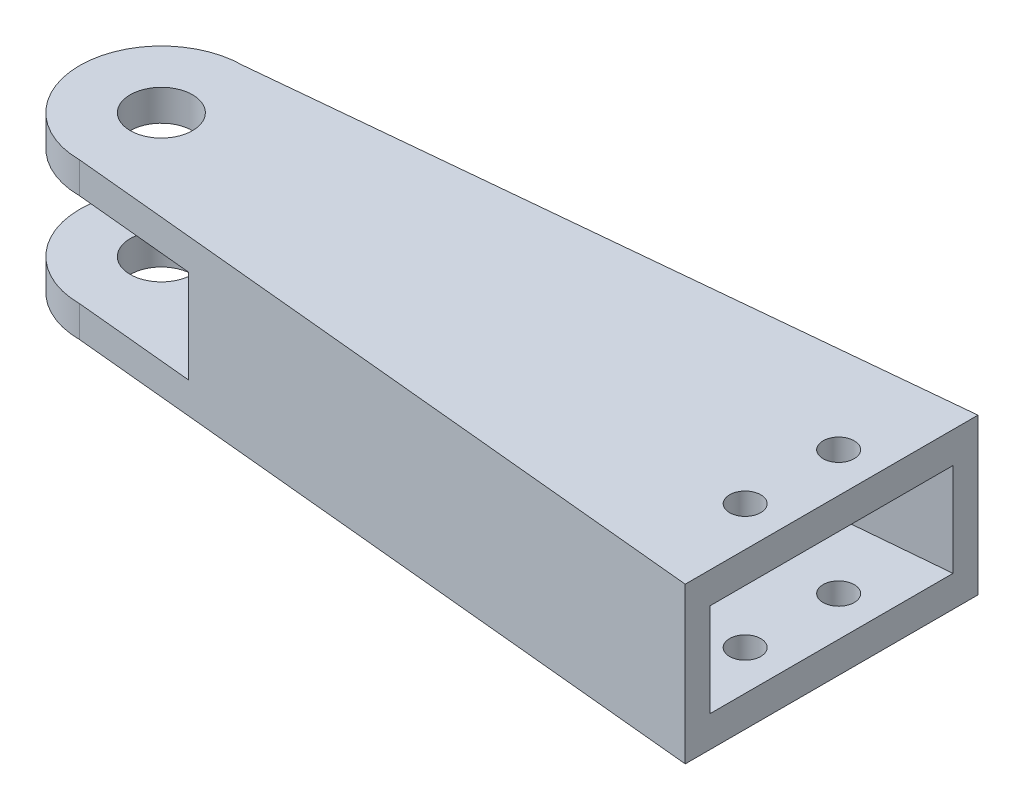
ISO-10303-21;
HEADER;
FILE_DESCRIPTION(('STEP AP214'),'2;1');
FILE_NAME('part.step','',(''),(''),'','','');
FILE_SCHEMA(('AUTOMOTIVE_DESIGN { 1 0 10303 214 1 1 1 1 }'));
ENDSEC;
DATA;
#1=APPLICATION_CONTEXT('core data for automotive mechanical design processes');
#2=APPLICATION_PROTOCOL_DEFINITION('international standard','automotive_design',2000,#1);
#3=PRODUCT_CONTEXT('',#1,'mechanical');
#4=PRODUCT('Part','Part','',(#3));
#5=PRODUCT_RELATED_PRODUCT_CATEGORY('part','',(#4));
#6=PRODUCT_DEFINITION_FORMATION('','',#4);
#7=PRODUCT_DEFINITION_CONTEXT('part definition',#1,'design');
#8=PRODUCT_DEFINITION('design','',#6,#7);
#9=PRODUCT_DEFINITION_SHAPE('','',#8);
#10=(LENGTH_UNIT() NAMED_UNIT(*) SI_UNIT(.MILLI.,.METRE.));
#11=(NAMED_UNIT(*) PLANE_ANGLE_UNIT() SI_UNIT($,.RADIAN.));
#12=(NAMED_UNIT(*) SI_UNIT($,.STERADIAN.) SOLID_ANGLE_UNIT());
#13=UNCERTAINTY_MEASURE_WITH_UNIT(LENGTH_MEASURE(1.E-05),#10,'distance_accuracy_value','');
#14=(GEOMETRIC_REPRESENTATION_CONTEXT(3) GLOBAL_UNCERTAINTY_ASSIGNED_CONTEXT((#13)) GLOBAL_UNIT_ASSIGNED_CONTEXT((#10,
#11,#12)) REPRESENTATION_CONTEXT('',''));
#15=CARTESIAN_POINT('',(0.,0.,0.));
#16=DIRECTION('',(0.,0.,1.));
#17=DIRECTION('',(1.,0.,0.));
#18=AXIS2_PLACEMENT_3D('',#15,#16,#17);
#19=CARTESIAN_POINT('',(-86.1,10.,0.));
#20=DIRECTION('',(0.,-1.,0.));
#21=DIRECTION('',(0.,0.,-1.));
#22=AXIS2_PLACEMENT_3D('',#19,#20,#21);
#23=CYLINDRICAL_SURFACE('',#22,10.5);
#24=CARTESIAN_POINT('',(-86.1,6.,0.));
#25=DIRECTION('',(0.,1.,0.));
#26=DIRECTION('',(-1.,0.,0.));
#27=AXIS2_PLACEMENT_3D('',#24,#25,#26);
#28=CIRCLE('',#27,10.5);
#29=CARTESIAN_POINT('',(-86.1,6.,-10.5));
#30=VERTEX_POINT('',#29);
#31=CARTESIAN_POINT('',(-86.1,6.,10.5));
#32=VERTEX_POINT('',#31);
#33=EDGE_CURVE('E192',#30,#32,#28,.T.);
#34=ORIENTED_EDGE('',*,*,#33,.T.);
#35=DIRECTION('',(0.,-1.,0.));
#36=VECTOR('',#35,1.);
#37=CARTESIAN_POINT('',(-86.1,10.,10.5));
#38=LINE('',#37,#36);
#39=CARTESIAN_POINT('',(-86.1,10.,10.5));
#40=VERTEX_POINT('',#39);
#41=EDGE_CURVE('E151',#40,#32,#38,.T.);
#42=ORIENTED_EDGE('',*,*,#41,.F.);
#43=CARTESIAN_POINT('',(-86.1,10.,0.));
#44=DIRECTION('',(0.,1.,0.));
#45=DIRECTION('',(0.,0.,1.));
#46=AXIS2_PLACEMENT_3D('',#43,#44,#45);
#47=CIRCLE('',#46,10.5);
#48=CARTESIAN_POINT('',(-86.1,10.,-10.5));
#49=VERTEX_POINT('',#48);
#50=EDGE_CURVE('E238',#49,#40,#47,.T.);
#51=ORIENTED_EDGE('',*,*,#50,.F.);
#52=DIRECTION('',(0.,-1.,0.));
#53=VECTOR('',#52,1.);
#54=CARTESIAN_POINT('',(-86.1,10.,-10.5));
#55=LINE('',#54,#53);
#56=EDGE_CURVE('E42',#49,#30,#55,.T.);
#57=ORIENTED_EDGE('',*,*,#56,.T.);
#58=EDGE_LOOP('',(#34,#42,#51,#57));
#59=FACE_BOUND('',#58,.T.);
#60=ADVANCED_FACE('F34',(#59),#23,.T.);
#61=CARTESIAN_POINT('',(-86.1,10.,0.));
#62=DIRECTION('',(0.,-1.,0.));
#63=DIRECTION('',(0.,0.,-1.));
#64=AXIS2_PLACEMENT_3D('',#61,#62,#63);
#65=CYLINDRICAL_SURFACE('',#64,4.00000000000001);
#66=CARTESIAN_POINT('',(-86.1,6.,0.));
#67=DIRECTION('',(0.,1.,0.));
#68=DIRECTION('',(-1.,0.,0.));
#69=AXIS2_PLACEMENT_3D('',#66,#67,#68);
#70=CIRCLE('',#69,4.00000000000001);
#71=CARTESIAN_POINT('',(-90.1,6.,0.));
#72=VERTEX_POINT('',#71);
#73=EDGE_CURVE('E185',#72,#72,#70,.T.);
#74=ORIENTED_EDGE('',*,*,#73,.F.);
#75=EDGE_LOOP('',(#74));
#76=FACE_BOUND('',#75,.T.);
#77=CARTESIAN_POINT('',(-86.1,10.,0.));
#78=DIRECTION('',(0.,1.,0.));
#79=DIRECTION('',(0.,0.,1.));
#80=AXIS2_PLACEMENT_3D('',#77,#78,#79);
#81=CIRCLE('',#80,4.00000000000001);
#82=CARTESIAN_POINT('',(-86.1,10.,4.00000000000001));
#83=VERTEX_POINT('',#82);
#84=EDGE_CURVE('E139',#83,#83,#81,.T.);
#85=ORIENTED_EDGE('',*,*,#84,.T.);
#86=EDGE_LOOP('',(#85));
#87=FACE_BOUND('',#86,.T.);
#88=ADVANCED_FACE('F288',(#76,#87),#65,.F.);
#89=CARTESIAN_POINT('',(-5.1,10.,-6.005));
#90=DIRECTION('',(0.,-1.,0.));
#91=DIRECTION('',(0.,0.,-1.));
#92=AXIS2_PLACEMENT_3D('',#89,#90,#91);
#93=CYLINDRICAL_SURFACE('',#92,2.);
#94=CARTESIAN_POINT('',(-5.1,-6.,-6.005));
#95=DIRECTION('',(0.,-1.,0.));
#96=DIRECTION('',(0.,0.,-1.));
#97=AXIS2_PLACEMENT_3D('',#94,#95,#96);
#98=CIRCLE('',#97,2.);
#99=CARTESIAN_POINT('',(-5.1,-6.,-8.005));
#100=VERTEX_POINT('',#99);
#101=EDGE_CURVE('E164',#100,#100,#98,.T.);
#102=ORIENTED_EDGE('',*,*,#101,.F.);
#103=EDGE_LOOP('',(#102));
#104=FACE_BOUND('',#103,.T.);
#105=CARTESIAN_POINT('',(-5.1,-10.,-6.005));
#106=DIRECTION('',(0.,1.,0.));
#107=DIRECTION('',(0.,0.,1.));
#108=AXIS2_PLACEMENT_3D('',#105,#106,#107);
#109=CIRCLE('',#108,2.);
#110=CARTESIAN_POINT('',(-5.1,-10.,-4.005));
#111=VERTEX_POINT('',#110);
#112=EDGE_CURVE('E227',#111,#111,#109,.T.);
#113=ORIENTED_EDGE('',*,*,#112,.F.);
#114=EDGE_LOOP('',(#113));
#115=FACE_BOUND('',#114,.T.);
#116=ADVANCED_FACE('F292',(#104,#115),#93,.F.);
#117=CARTESIAN_POINT('',(-5.1,10.,6.005));
#118=DIRECTION('',(0.,-1.,0.));
#119=DIRECTION('',(0.,0.,-1.));
#120=AXIS2_PLACEMENT_3D('',#117,#118,#119);
#121=CYLINDRICAL_SURFACE('',#120,2.);
#122=CARTESIAN_POINT('',(-5.1,-6.,6.005));
#123=DIRECTION('',(0.,-1.,0.));
#124=DIRECTION('',(0.,0.,-1.));
#125=AXIS2_PLACEMENT_3D('',#122,#123,#124);
#126=CIRCLE('',#125,2.);
#127=CARTESIAN_POINT('',(-5.1,-6.,4.005));
#128=VERTEX_POINT('',#127);
#129=EDGE_CURVE('E161',#128,#128,#126,.T.);
#130=ORIENTED_EDGE('',*,*,#129,.F.);
#131=EDGE_LOOP('',(#130));
#132=FACE_BOUND('',#131,.T.);
#133=CARTESIAN_POINT('',(-5.1,-10.,6.005));
#134=DIRECTION('',(0.,1.,0.));
#135=DIRECTION('',(0.,0.,1.));
#136=AXIS2_PLACEMENT_3D('',#133,#134,#135);
#137=CIRCLE('',#136,2.);
#138=CARTESIAN_POINT('',(-5.1,-10.,8.005));
#139=VERTEX_POINT('',#138);
#140=EDGE_CURVE('E223',#139,#139,#137,.T.);
#141=ORIENTED_EDGE('',*,*,#140,.F.);
#142=EDGE_LOOP('',(#141));
#143=FACE_BOUND('',#142,.T.);
#144=ADVANCED_FACE('F299',(#132,#143),#121,.F.);
#145=CARTESIAN_POINT('',(-86.1,10.,0.));
#146=DIRECTION('',(0.,1.,0.));
#147=DIRECTION('',(0.,0.,1.));
#148=AXIS2_PLACEMENT_3D('',#145,#146,#147);
#149=PLANE('',#148);
#150=CARTESIAN_POINT('',(-5.1,10.,-6.005));
#151=DIRECTION('',(0.,1.,0.));
#152=DIRECTION('',(0.,0.,1.));
#153=AXIS2_PLACEMENT_3D('',#150,#151,#152);
#154=CIRCLE('',#153,2.);
#155=CARTESIAN_POINT('',(-5.1,10.,-4.005));
#156=VERTEX_POINT('',#155);
#157=EDGE_CURVE('E230',#156,#156,#154,.T.);
#158=ORIENTED_EDGE('',*,*,#157,.F.);
#159=EDGE_LOOP('',(#158));
#160=FACE_BOUND('',#159,.T.);
#161=DIRECTION('',(-0.995380177469115,0.,0.0960119904051219));
#162=VECTOR('',#161,1.);
#163=CARTESIAN_POINT('',(-86.1,10.,-10.5));
#164=LINE('',#163,#162);
#165=CARTESIAN_POINT('',(0.,10.,-18.805));
#166=VERTEX_POINT('',#165);
#167=EDGE_CURVE('E122',#166,#49,#164,.T.);
#168=ORIENTED_EDGE('',*,*,#167,.T.);
#169=ORIENTED_EDGE('',*,*,#50,.T.);
#170=DIRECTION('',(0.995380177469115,0.,0.0960119904051219));
#171=VECTOR('',#170,1.);
#172=CARTESIAN_POINT('',(-86.1,10.,10.5));
#173=LINE('',#172,#171);
#174=CARTESIAN_POINT('',(0.,10.,18.805));
#175=VERTEX_POINT('',#174);
#176=EDGE_CURVE('E239',#40,#175,#173,.T.);
#177=ORIENTED_EDGE('',*,*,#176,.T.);
#178=DIRECTION('',(0.,0.,-1.));
#179=VECTOR('',#178,1.);
#180=CARTESIAN_POINT('',(0.,10.,-18.805));
#181=LINE('',#180,#179);
#182=EDGE_CURVE('E132',#175,#166,#181,.T.);
#183=ORIENTED_EDGE('',*,*,#182,.T.);
#184=EDGE_LOOP('',(#168,#169,#177,#183));
#185=FACE_BOUND('',#184,.T.);
#186=ORIENTED_EDGE('',*,*,#84,.F.);
#187=EDGE_LOOP('',(#186));
#188=FACE_BOUND('',#187,.T.);
#189=CARTESIAN_POINT('',(-5.1,10.,6.005));
#190=DIRECTION('',(0.,1.,0.));
#191=DIRECTION('',(0.,0.,1.));
#192=AXIS2_PLACEMENT_3D('',#189,#190,#191);
#193=CIRCLE('',#192,2.);
#194=CARTESIAN_POINT('',(-5.1,10.,8.005));
#195=VERTEX_POINT('',#194);
#196=EDGE_CURVE('E224',#195,#195,#193,.T.);
#197=ORIENTED_EDGE('',*,*,#196,.F.);
#198=EDGE_LOOP('',(#197));
#199=FACE_BOUND('',#198,.T.);
#200=ADVANCED_FACE('F242',(#160,#185,#188,#199),#149,.T.);
#201=CARTESIAN_POINT('',(-86.1,-10.,0.));
#202=DIRECTION('',(0.,1.,0.));
#203=DIRECTION('',(0.,0.,1.));
#204=AXIS2_PLACEMENT_3D('',#201,#202,#203);
#205=PLANE('',#204);
#206=DIRECTION('',(-0.995380177469115,0.,0.0960119904051219));
#207=VECTOR('',#206,1.);
#208=CARTESIAN_POINT('',(-86.1,-10.,-10.5));
#209=LINE('',#208,#207);
#210=CARTESIAN_POINT('',(0.,-10.,-18.805));
#211=VERTEX_POINT('',#210);
#212=CARTESIAN_POINT('',(-86.1,-10.,-10.5));
#213=VERTEX_POINT('',#212);
#214=EDGE_CURVE('E129',#211,#213,#209,.T.);
#215=ORIENTED_EDGE('',*,*,#214,.F.);
#216=DIRECTION('',(0.,0.,-1.));
#217=VECTOR('',#216,1.);
#218=CARTESIAN_POINT('',(0.,-10.,-18.805));
#219=LINE('',#218,#217);
#220=CARTESIAN_POINT('',(0.,-10.,18.805));
#221=VERTEX_POINT('',#220);
#222=EDGE_CURVE('E113',#221,#211,#219,.T.);
#223=ORIENTED_EDGE('',*,*,#222,.F.);
#224=DIRECTION('',(0.995380177469115,0.,0.0960119904051219));
#225=VECTOR('',#224,1.);
#226=CARTESIAN_POINT('',(-86.1,-10.,10.5));
#227=LINE('',#226,#225);
#228=CARTESIAN_POINT('',(-86.1,-10.,10.5));
#229=VERTEX_POINT('',#228);
#230=EDGE_CURVE('E107',#229,#221,#227,.T.);
#231=ORIENTED_EDGE('',*,*,#230,.F.);
#232=CARTESIAN_POINT('',(-86.1,-10.,0.));
#233=DIRECTION('',(0.,1.,0.));
#234=DIRECTION('',(0.,0.,1.));
#235=AXIS2_PLACEMENT_3D('',#232,#233,#234);
#236=CIRCLE('',#235,10.5);
#237=EDGE_CURVE('E138',#213,#229,#236,.T.);
#238=ORIENTED_EDGE('',*,*,#237,.F.);
#239=EDGE_LOOP('',(#215,#223,#231,#238));
#240=FACE_BOUND('',#239,.T.);
#241=CARTESIAN_POINT('',(-86.1,-10.,0.));
#242=DIRECTION('',(0.,1.,0.));
#243=DIRECTION('',(0.,0.,1.));
#244=AXIS2_PLACEMENT_3D('',#241,#242,#243);
#245=CIRCLE('',#244,4.00000000000001);
#246=CARTESIAN_POINT('',(-86.1,-10.,4.00000000000001));
#247=VERTEX_POINT('',#246);
#248=EDGE_CURVE('E143',#247,#247,#245,.T.);
#249=ORIENTED_EDGE('',*,*,#248,.T.);
#250=EDGE_LOOP('',(#249));
#251=FACE_BOUND('',#250,.T.);
#252=ORIENTED_EDGE('',*,*,#112,.T.);
#253=EDGE_LOOP('',(#252));
#254=FACE_BOUND('',#253,.T.);
#255=ORIENTED_EDGE('',*,*,#140,.T.);
#256=EDGE_LOOP('',(#255));
#257=FACE_BOUND('',#256,.T.);
#258=ADVANCED_FACE('F135',(#240,#251,#254,#257),#205,.F.);
#259=CARTESIAN_POINT('',(-86.1,10.,-10.5));
#260=DIRECTION('',(0.0960119904051219,0.,0.995380177469115));
#261=DIRECTION('',(0.995380177469115,0.,-0.0960119904051219));
#262=AXIS2_PLACEMENT_3D('',#259,#260,#261);
#263=PLANE('',#262);
#264=DIRECTION('',(0.,1.,0.));
#265=VECTOR('',#264,1.);
#266=CARTESIAN_POINT('',(-70.6,10.,-11.9950929152149));
#267=LINE('',#266,#265);
#268=CARTESIAN_POINT('',(-70.6,-6.,-11.9950929152149));
#269=VERTEX_POINT('',#268);
#270=CARTESIAN_POINT('',(-70.6,6.,-11.9950929152149));
#271=VERTEX_POINT('',#270);
#272=EDGE_CURVE('E205',#269,#271,#267,.T.);
#273=ORIENTED_EDGE('',*,*,#272,.T.);
#274=DIRECTION('',(-0.995380177469115,0.,0.0960119904051219));
#275=VECTOR('',#274,1.);
#276=CARTESIAN_POINT('',(-86.1,6.,-10.5));
#277=LINE('',#276,#275);
#278=EDGE_CURVE('E202',#271,#30,#277,.T.);
#279=ORIENTED_EDGE('',*,*,#278,.T.);
#280=ORIENTED_EDGE('',*,*,#56,.F.);
#281=ORIENTED_EDGE('',*,*,#167,.F.);
#282=DIRECTION('',(0.,-1.,0.));
#283=VECTOR('',#282,1.);
#284=CARTESIAN_POINT('',(0.,10.,-18.805));
#285=LINE('',#284,#283);
#286=EDGE_CURVE('E117',#166,#211,#285,.T.);
#287=ORIENTED_EDGE('',*,*,#286,.T.);
#288=ORIENTED_EDGE('',*,*,#214,.T.);
#289=CARTESIAN_POINT('',(-86.1,-6.,-10.5));
#290=VERTEX_POINT('',#289);
#291=EDGE_CURVE('E154',#290,#213,#55,.T.);
#292=ORIENTED_EDGE('',*,*,#291,.F.);
#293=DIRECTION('',(0.995380177469115,0.,-0.0960119904051219));
#294=VECTOR('',#293,1.);
#295=CARTESIAN_POINT('',(-86.1,-6.,-10.5));
#296=LINE('',#295,#294);
#297=EDGE_CURVE('E188',#290,#269,#296,.T.);
#298=ORIENTED_EDGE('',*,*,#297,.T.);
#299=EDGE_LOOP('',(#273,#279,#280,#281,#287,#288,#292,#298));
#300=FACE_BOUND('',#299,.T.);
#301=ADVANCED_FACE('F127',(#300),#263,.F.);
#302=CARTESIAN_POINT('',(-86.1,-6.,10.5));
#303=VERTEX_POINT('',#302);
#304=EDGE_CURVE('E150',#303,#229,#38,.T.);
#305=ORIENTED_EDGE('',*,*,#304,.F.);
#306=CARTESIAN_POINT('',(-86.1,-6.,0.));
#307=DIRECTION('',(0.,-1.,0.));
#308=DIRECTION('',(1.,0.,0.));
#309=AXIS2_PLACEMENT_3D('',#306,#307,#308);
#310=CIRCLE('',#309,10.5);
#311=EDGE_CURVE('E49',#303,#290,#310,.T.);
#312=ORIENTED_EDGE('',*,*,#311,.T.);
#313=ORIENTED_EDGE('',*,*,#291,.T.);
#314=ORIENTED_EDGE('',*,*,#237,.T.);
#315=EDGE_LOOP('',(#305,#312,#313,#314));
#316=FACE_BOUND('',#315,.T.);
#317=ADVANCED_FACE('F278',(#316),#23,.T.);
#318=CARTESIAN_POINT('',(-86.1,10.,10.5));
#319=DIRECTION('',(0.0960119904051219,0.,-0.995380177469115));
#320=DIRECTION('',(-0.995380177469115,0.,-0.0960119904051219));
#321=AXIS2_PLACEMENT_3D('',#318,#319,#320);
#322=PLANE('',#321);
#323=ORIENTED_EDGE('',*,*,#41,.T.);
#324=DIRECTION('',(0.995380177469115,0.,0.0960119904051219));
#325=VECTOR('',#324,1.);
#326=CARTESIAN_POINT('',(-86.1,6.,10.5));
#327=LINE('',#326,#325);
#328=CARTESIAN_POINT('',(-70.6,6.,11.9950929152149));
#329=VERTEX_POINT('',#328);
#330=EDGE_CURVE('E187',#32,#329,#327,.T.);
#331=ORIENTED_EDGE('',*,*,#330,.T.);
#332=DIRECTION('',(0.,-1.,0.));
#333=VECTOR('',#332,1.);
#334=CARTESIAN_POINT('',(-70.6,10.,11.9950929152149));
#335=LINE('',#334,#333);
#336=CARTESIAN_POINT('',(-70.6,-6.,11.9950929152149));
#337=VERTEX_POINT('',#336);
#338=EDGE_CURVE('E11',#329,#337,#335,.T.);
#339=ORIENTED_EDGE('',*,*,#338,.T.);
#340=DIRECTION('',(-0.995380177469115,0.,-0.0960119904051219));
#341=VECTOR('',#340,1.);
#342=CARTESIAN_POINT('',(-86.1,-6.,10.5));
#343=LINE('',#342,#341);
#344=EDGE_CURVE('E183',#337,#303,#343,.T.);
#345=ORIENTED_EDGE('',*,*,#344,.T.);
#346=ORIENTED_EDGE('',*,*,#304,.T.);
#347=ORIENTED_EDGE('',*,*,#230,.T.);
#348=DIRECTION('',(0.,-1.,0.));
#349=VECTOR('',#348,1.);
#350=CARTESIAN_POINT('',(0.,10.,18.805));
#351=LINE('',#350,#349);
#352=EDGE_CURVE('E119',#175,#221,#351,.T.);
#353=ORIENTED_EDGE('',*,*,#352,.F.);
#354=ORIENTED_EDGE('',*,*,#176,.F.);
#355=EDGE_LOOP('',(#323,#331,#339,#345,#346,#347,#353,#354));
#356=FACE_BOUND('',#355,.T.);
#357=ADVANCED_FACE('F276',(#356),#322,.F.);
#358=CARTESIAN_POINT('',(0.,10.,-18.805));
#359=DIRECTION('',(-1.,0.,0.));
#360=DIRECTION('',(0.,0.,1.));
#361=AXIS2_PLACEMENT_3D('',#358,#359,#360);
#362=PLANE('',#361);
#363=DIRECTION('',(0.,0.,1.));
#364=VECTOR('',#363,1.);
#365=CARTESIAN_POINT('',(0.,6.,15.595));
#366=LINE('',#365,#364);
#367=CARTESIAN_POINT('',(0.,6.,-15.595));
#368=VERTEX_POINT('',#367);
#369=CARTESIAN_POINT('',(0.,6.,15.595));
#370=VERTEX_POINT('',#369);
#371=EDGE_CURVE('E212',#368,#370,#366,.T.);
#372=ORIENTED_EDGE('',*,*,#371,.F.);
#373=DIRECTION('',(0.,1.,0.));
#374=VECTOR('',#373,1.);
#375=CARTESIAN_POINT('',(0.,6.,-15.595));
#376=LINE('',#375,#374);
#377=CARTESIAN_POINT('',(0.,-6.,-15.595));
#378=VERTEX_POINT('',#377);
#379=EDGE_CURVE('E58',#378,#368,#376,.T.);
#380=ORIENTED_EDGE('',*,*,#379,.F.);
#381=DIRECTION('',(0.,0.,-1.));
#382=VECTOR('',#381,1.);
#383=CARTESIAN_POINT('',(0.,-6.,15.595));
#384=LINE('',#383,#382);
#385=CARTESIAN_POINT('',(0.,-6.,15.595));
#386=VERTEX_POINT('',#385);
#387=EDGE_CURVE('E179',#386,#378,#384,.T.);
#388=ORIENTED_EDGE('',*,*,#387,.F.);
#389=DIRECTION('',(0.,-1.,0.));
#390=VECTOR('',#389,1.);
#391=CARTESIAN_POINT('',(0.,6.,15.595));
#392=LINE('',#391,#390);
#393=EDGE_CURVE('E215',#370,#386,#392,.T.);
#394=ORIENTED_EDGE('',*,*,#393,.F.);
#395=EDGE_LOOP('',(#372,#380,#388,#394));
#396=FACE_BOUND('',#395,.T.);
#397=ORIENTED_EDGE('',*,*,#222,.T.);
#398=ORIENTED_EDGE('',*,*,#286,.F.);
#399=ORIENTED_EDGE('',*,*,#182,.F.);
#400=ORIENTED_EDGE('',*,*,#352,.T.);
#401=EDGE_LOOP('',(#397,#398,#399,#400));
#402=FACE_BOUND('',#401,.T.);
#403=ADVANCED_FACE('F115',(#396,#402),#362,.F.);
#404=CARTESIAN_POINT('',(-86.1,-6.,0.));
#405=DIRECTION('',(0.,-1.,0.));
#406=DIRECTION('',(1.,0.,0.));
#407=AXIS2_PLACEMENT_3D('',#404,#405,#406);
#408=CIRCLE('',#407,4.00000000000001);
#409=CARTESIAN_POINT('',(-82.1,-6.,0.));
#410=VERTEX_POINT('',#409);
#411=EDGE_CURVE('E181',#410,#410,#408,.T.);
#412=ORIENTED_EDGE('',*,*,#411,.F.);
#413=EDGE_LOOP('',(#412));
#414=FACE_BOUND('',#413,.T.);
#415=ORIENTED_EDGE('',*,*,#248,.F.);
#416=EDGE_LOOP('',(#415));
#417=FACE_BOUND('',#416,.T.);
#418=ADVANCED_FACE('F295',(#414,#417),#65,.F.);
#419=CARTESIAN_POINT('',(-5.1,6.,-6.005));
#420=DIRECTION('',(0.,1.,0.));
#421=DIRECTION('',(0.,0.,1.));
#422=AXIS2_PLACEMENT_3D('',#419,#420,#421);
#423=CIRCLE('',#422,2.);
#424=CARTESIAN_POINT('',(-5.1,6.,-4.005));
#425=VERTEX_POINT('',#424);
#426=EDGE_CURVE('E160',#425,#425,#423,.T.);
#427=ORIENTED_EDGE('',*,*,#426,.F.);
#428=EDGE_LOOP('',(#427));
#429=FACE_BOUND('',#428,.T.);
#430=ORIENTED_EDGE('',*,*,#157,.T.);
#431=EDGE_LOOP('',(#430));
#432=FACE_BOUND('',#431,.T.);
#433=ADVANCED_FACE('F302',(#429,#432),#93,.F.);
#434=CARTESIAN_POINT('',(-5.1,6.,6.005));
#435=DIRECTION('',(0.,1.,0.));
#436=DIRECTION('',(0.,0.,1.));
#437=AXIS2_PLACEMENT_3D('',#434,#435,#436);
#438=CIRCLE('',#437,2.);
#439=CARTESIAN_POINT('',(-5.1,6.,8.005));
#440=VERTEX_POINT('',#439);
#441=EDGE_CURVE('E157',#440,#440,#438,.T.);
#442=ORIENTED_EDGE('',*,*,#441,.F.);
#443=EDGE_LOOP('',(#442));
#444=FACE_BOUND('',#443,.T.);
#445=ORIENTED_EDGE('',*,*,#196,.T.);
#446=EDGE_LOOP('',(#445));
#447=FACE_BOUND('',#446,.T.);
#448=ADVANCED_FACE('F311',(#444,#447),#121,.F.);
#449=CARTESIAN_POINT('',(0.,6.,-15.595));
#450=DIRECTION('',(0.0877327517874201,0.,0.996144047948793));
#451=DIRECTION('',(0.996144047948793,0.,-0.0877327517874201));
#452=AXIS2_PLACEMENT_3D('',#449,#450,#451);
#453=PLANE('',#452);
#454=ORIENTED_EDGE('',*,*,#379,.T.);
#455=DIRECTION('',(-0.996144047948793,0.,0.0877327517874201));
#456=VECTOR('',#455,1.);
#457=CARTESIAN_POINT('',(0.,6.,-15.595));
#458=LINE('',#457,#456);
#459=CARTESIAN_POINT('',(-20.,6.,-13.8335529087269));
#460=VERTEX_POINT('',#459);
#461=EDGE_CURVE('E79',#460,#368,#458,.F.);
#462=ORIENTED_EDGE('',*,*,#461,.F.);
#463=DIRECTION('',(0.,-1.,0.));
#464=VECTOR('',#463,1.);
#465=CARTESIAN_POINT('',(-20.,0.,-13.8335529087269));
#466=LINE('',#465,#464);
#467=CARTESIAN_POINT('',(-20.,-6.,-13.8335529087269));
#468=VERTEX_POINT('',#467);
#469=EDGE_CURVE('E176',#468,#460,#466,.F.);
#470=ORIENTED_EDGE('',*,*,#469,.F.);
#471=DIRECTION('',(-0.996144047948793,0.,0.0877327517874201));
#472=VECTOR('',#471,1.);
#473=CARTESIAN_POINT('',(-22.5718924459912,-6.,-13.607040285324));
#474=LINE('',#473,#472);
#475=EDGE_CURVE('E83',#468,#378,#474,.F.);
#476=ORIENTED_EDGE('',*,*,#475,.T.);
#477=EDGE_LOOP('',(#454,#462,#470,#476));
#478=FACE_BOUND('',#477,.T.);
#479=ADVANCED_FACE('F36',(#478),#453,.T.);
#480=CARTESIAN_POINT('',(-20.,-6.,15.595));
#481=DIRECTION('',(0.,-1.,0.));
#482=DIRECTION('',(0.,0.,-1.));
#483=AXIS2_PLACEMENT_3D('',#480,#481,#482);
#484=PLANE('',#483);
#485=ORIENTED_EDGE('',*,*,#101,.T.);
#486=EDGE_LOOP('',(#485));
#487=FACE_BOUND('',#486,.T.);
#488=ORIENTED_EDGE('',*,*,#129,.T.);
#489=EDGE_LOOP('',(#488));
#490=FACE_BOUND('',#489,.T.);
#491=ORIENTED_EDGE('',*,*,#387,.T.);
#492=ORIENTED_EDGE('',*,*,#475,.F.);
#493=DIRECTION('',(0.,0.,-1.));
#494=VECTOR('',#493,1.);
#495=CARTESIAN_POINT('',(-20.,-6.,15.595));
#496=LINE('',#495,#494);
#497=CARTESIAN_POINT('',(-20.,-6.,13.8335529087269));
#498=VERTEX_POINT('',#497);
#499=EDGE_CURVE('E172',#498,#468,#496,.T.);
#500=ORIENTED_EDGE('',*,*,#499,.F.);
#501=DIRECTION('',(-0.996144047948793,0.,-0.0877327517874203));
#502=VECTOR('',#501,1.);
#503=CARTESIAN_POINT('',(0.,-6.,15.595));
#504=LINE('',#503,#502);
#505=EDGE_CURVE('E168',#498,#386,#504,.F.);
#506=ORIENTED_EDGE('',*,*,#505,.T.);
#507=EDGE_LOOP('',(#491,#492,#500,#506));
#508=FACE_BOUND('',#507,.T.);
#509=ADVANCED_FACE('F339',(#487,#490,#508),#484,.F.);
#510=CARTESIAN_POINT('',(0.,6.,15.595));
#511=DIRECTION('',(0.0877327517874203,0.,-0.996144047948793));
#512=DIRECTION('',(-0.996144047948793,0.,-0.0877327517874203));
#513=AXIS2_PLACEMENT_3D('',#510,#511,#512);
#514=PLANE('',#513);
#515=ORIENTED_EDGE('',*,*,#393,.T.);
#516=ORIENTED_EDGE('',*,*,#505,.F.);
#517=DIRECTION('',(0.,1.,0.));
#518=VECTOR('',#517,1.);
#519=CARTESIAN_POINT('',(-20.,0.,13.8335529087269));
#520=LINE('',#519,#518);
#521=CARTESIAN_POINT('',(-20.,6.,13.8335529087269));
#522=VERTEX_POINT('',#521);
#523=EDGE_CURVE('E169',#522,#498,#520,.F.);
#524=ORIENTED_EDGE('',*,*,#523,.F.);
#525=DIRECTION('',(-0.996144047948793,0.,-0.0877327517874203));
#526=VECTOR('',#525,1.);
#527=CARTESIAN_POINT('',(-19.8460592852761,6.,13.8471108299359));
#528=LINE('',#527,#526);
#529=EDGE_CURVE('E165',#522,#370,#528,.F.);
#530=ORIENTED_EDGE('',*,*,#529,.T.);
#531=EDGE_LOOP('',(#515,#516,#524,#530));
#532=FACE_BOUND('',#531,.T.);
#533=ADVANCED_FACE('F349',(#532),#514,.T.);
#534=CARTESIAN_POINT('',(-20.,6.,15.595));
#535=DIRECTION('',(0.,1.,0.));
#536=DIRECTION('',(0.,0.,1.));
#537=AXIS2_PLACEMENT_3D('',#534,#535,#536);
#538=PLANE('',#537);
#539=ORIENTED_EDGE('',*,*,#426,.T.);
#540=EDGE_LOOP('',(#539));
#541=FACE_BOUND('',#540,.T.);
#542=ORIENTED_EDGE('',*,*,#441,.T.);
#543=EDGE_LOOP('',(#542));
#544=FACE_BOUND('',#543,.T.);
#545=ORIENTED_EDGE('',*,*,#371,.T.);
#546=ORIENTED_EDGE('',*,*,#529,.F.);
#547=DIRECTION('',(0.,0.,1.));
#548=VECTOR('',#547,1.);
#549=CARTESIAN_POINT('',(-20.,6.,15.595));
#550=LINE('',#549,#548);
#551=EDGE_CURVE('E173',#460,#522,#550,.T.);
#552=ORIENTED_EDGE('',*,*,#551,.F.);
#553=ORIENTED_EDGE('',*,*,#461,.T.);
#554=EDGE_LOOP('',(#545,#546,#552,#553));
#555=FACE_BOUND('',#554,.T.);
#556=ADVANCED_FACE('F345',(#541,#544,#555),#538,.F.);
#557=CARTESIAN_POINT('',(-20.,0.,0.));
#558=DIRECTION('',(1.,0.,0.));
#559=DIRECTION('',(0.,0.,-1.));
#560=AXIS2_PLACEMENT_3D('',#557,#558,#559);
#561=PLANE('',#560);
#562=ORIENTED_EDGE('',*,*,#469,.T.);
#563=ORIENTED_EDGE('',*,*,#551,.T.);
#564=ORIENTED_EDGE('',*,*,#523,.T.);
#565=ORIENTED_EDGE('',*,*,#499,.T.);
#566=EDGE_LOOP('',(#562,#563,#564,#565));
#567=FACE_BOUND('',#566,.T.);
#568=ADVANCED_FACE('F348',(#567),#561,.T.);
#569=CARTESIAN_POINT('',(-70.6,-6.,-18.805));
#570=DIRECTION('',(1.,0.,0.));
#571=DIRECTION('',(0.,0.,-1.));
#572=AXIS2_PLACEMENT_3D('',#569,#570,#571);
#573=PLANE('',#572);
#574=DIRECTION('',(0.,0.,1.));
#575=VECTOR('',#574,1.);
#576=CARTESIAN_POINT('',(-70.6,-6.,-18.805));
#577=LINE('',#576,#575);
#578=EDGE_CURVE('E270',#269,#337,#577,.T.);
#579=ORIENTED_EDGE('',*,*,#578,.T.);
#580=ORIENTED_EDGE('',*,*,#338,.F.);
#581=DIRECTION('',(0.,0.,1.));
#582=VECTOR('',#581,1.);
#583=CARTESIAN_POINT('',(-70.6,6.,-18.805));
#584=LINE('',#583,#582);
#585=EDGE_CURVE('E184',#271,#329,#584,.T.);
#586=ORIENTED_EDGE('',*,*,#585,.F.);
#587=ORIENTED_EDGE('',*,*,#272,.F.);
#588=EDGE_LOOP('',(#579,#580,#586,#587));
#589=FACE_BOUND('',#588,.T.);
#590=ADVANCED_FACE('F269',(#589),#573,.F.);
#591=CARTESIAN_POINT('',(-70.6,6.,-18.805));
#592=DIRECTION('',(0.,1.,0.));
#593=DIRECTION('',(-1.,0.,0.));
#594=AXIS2_PLACEMENT_3D('',#591,#592,#593);
#595=PLANE('',#594);
#596=ORIENTED_EDGE('',*,*,#73,.T.);
#597=EDGE_LOOP('',(#596));
#598=FACE_BOUND('',#597,.T.);
#599=ORIENTED_EDGE('',*,*,#585,.T.);
#600=ORIENTED_EDGE('',*,*,#330,.F.);
#601=ORIENTED_EDGE('',*,*,#33,.F.);
#602=ORIENTED_EDGE('',*,*,#278,.F.);
#603=EDGE_LOOP('',(#599,#600,#601,#602));
#604=FACE_BOUND('',#603,.T.);
#605=ADVANCED_FACE('F371',(#598,#604),#595,.F.);
#606=CARTESIAN_POINT('',(-70.6,-6.,-18.805));
#607=DIRECTION('',(0.,-1.,0.));
#608=DIRECTION('',(1.,0.,0.));
#609=AXIS2_PLACEMENT_3D('',#606,#607,#608);
#610=PLANE('',#609);
#611=ORIENTED_EDGE('',*,*,#411,.T.);
#612=EDGE_LOOP('',(#611));
#613=FACE_BOUND('',#612,.T.);
#614=ORIENTED_EDGE('',*,*,#311,.F.);
#615=ORIENTED_EDGE('',*,*,#344,.F.);
#616=ORIENTED_EDGE('',*,*,#578,.F.);
#617=ORIENTED_EDGE('',*,*,#297,.F.);
#618=EDGE_LOOP('',(#614,#615,#616,#617));
#619=FACE_BOUND('',#618,.T.);
#620=ADVANCED_FACE('F272',(#613,#619),#610,.F.);
#621=CLOSED_SHELL('',(#60,#88,#116,#144,#200,#258,#301,#317,#357,#403,#418,#433,#448,#479,#509,
#533,#556,#568,#590,#605,#620));
#622=MANIFOLD_SOLID_BREP('B2',#621);
#623=ADVANCED_BREP_SHAPE_REPRESENTATION('',(#18,#622),#14);
#624=SHAPE_DEFINITION_REPRESENTATION(#9,#623);
ENDSEC;
END-ISO-10303-21;
